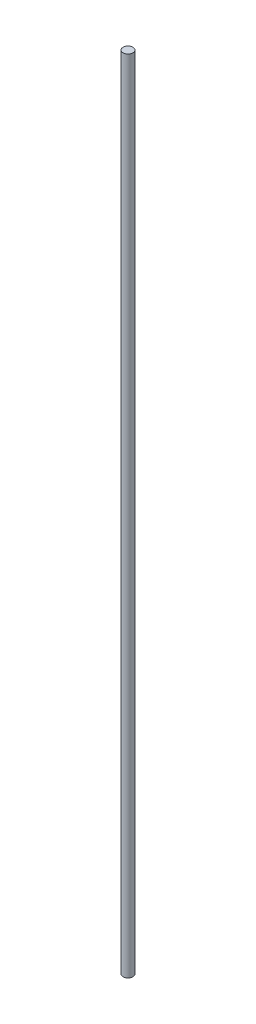
ISO-10303-21;
HEADER;
FILE_DESCRIPTION(('STEP AP214'),'2;1');
FILE_NAME('part.step','',(''),(''),'','','');
FILE_SCHEMA(('AUTOMOTIVE_DESIGN { 1 0 10303 214 1 1 1 1 }'));
ENDSEC;
DATA;
#1=APPLICATION_CONTEXT('core data for automotive mechanical design processes');
#2=APPLICATION_PROTOCOL_DEFINITION('international standard','automotive_design',2000,#1);
#3=PRODUCT_CONTEXT('',#1,'mechanical');
#4=PRODUCT('Part','Part','',(#3));
#5=PRODUCT_RELATED_PRODUCT_CATEGORY('part','',(#4));
#6=PRODUCT_DEFINITION_FORMATION('','',#4);
#7=PRODUCT_DEFINITION_CONTEXT('part definition',#1,'design');
#8=PRODUCT_DEFINITION('design','',#6,#7);
#9=PRODUCT_DEFINITION_SHAPE('','',#8);
#10=(LENGTH_UNIT() NAMED_UNIT(*) SI_UNIT(.MILLI.,.METRE.));
#11=(NAMED_UNIT(*) PLANE_ANGLE_UNIT() SI_UNIT($,.RADIAN.));
#12=(NAMED_UNIT(*) SI_UNIT($,.STERADIAN.) SOLID_ANGLE_UNIT());
#13=UNCERTAINTY_MEASURE_WITH_UNIT(LENGTH_MEASURE(1.E-05),#10,'distance_accuracy_value','');
#14=(GEOMETRIC_REPRESENTATION_CONTEXT(3) GLOBAL_UNCERTAINTY_ASSIGNED_CONTEXT((#13)) GLOBAL_UNIT_ASSIGNED_CONTEXT((#10,
#11,#12)) REPRESENTATION_CONTEXT('',''));
#15=CARTESIAN_POINT('',(0.,0.,0.));
#16=DIRECTION('',(0.,0.,1.));
#17=DIRECTION('',(1.,0.,0.));
#18=AXIS2_PLACEMENT_3D('',#15,#16,#17);
#19=CARTESIAN_POINT('',(0.,1828.8,0.));
#20=DIRECTION('',(0.,-1.,0.));
#21=DIRECTION('',(0.,0.,-1.));
#22=AXIS2_PLACEMENT_3D('',#19,#20,#21);
#23=CYLINDRICAL_SURFACE('',#22,11.25);
#24=CARTESIAN_POINT('',(0.,1828.8,0.));
#25=DIRECTION('',(0.,1.,0.));
#26=DIRECTION('',(0.,0.,1.));
#27=AXIS2_PLACEMENT_3D('',#24,#25,#26);
#28=CIRCLE('',#27,11.25);
#29=CARTESIAN_POINT('',(0.,1828.8,11.25));
#30=VERTEX_POINT('',#29);
#31=EDGE_CURVE('E10',#30,#30,#28,.T.);
#32=ORIENTED_EDGE('',*,*,#31,.F.);
#33=EDGE_LOOP('',(#32));
#34=FACE_BOUND('',#33,.T.);
#35=CARTESIAN_POINT('',(0.,0.,0.));
#36=DIRECTION('',(0.,1.,0.));
#37=DIRECTION('',(0.,0.,1.));
#38=AXIS2_PLACEMENT_3D('',#35,#36,#37);
#39=CIRCLE('',#38,11.25);
#40=CARTESIAN_POINT('',(0.,0.,11.25));
#41=VERTEX_POINT('',#40);
#42=EDGE_CURVE('E34',#41,#41,#39,.T.);
#43=ORIENTED_EDGE('',*,*,#42,.T.);
#44=EDGE_LOOP('',(#43));
#45=FACE_BOUND('',#44,.T.);
#46=ADVANCED_FACE('F31',(#34,#45),#23,.T.);
#47=CARTESIAN_POINT('',(0.,1828.8,0.));
#48=DIRECTION('',(0.,1.,0.));
#49=DIRECTION('',(0.,0.,1.));
#50=AXIS2_PLACEMENT_3D('',#47,#48,#49);
#51=PLANE('',#50);
#52=ORIENTED_EDGE('',*,*,#31,.T.);
#53=EDGE_LOOP('',(#52));
#54=FACE_BOUND('',#53,.T.);
#55=ADVANCED_FACE('F46',(#54),#51,.T.);
#56=CARTESIAN_POINT('',(0.,0.,0.));
#57=DIRECTION('',(0.,1.,0.));
#58=DIRECTION('',(0.,0.,1.));
#59=AXIS2_PLACEMENT_3D('',#56,#57,#58);
#60=PLANE('',#59);
#61=ORIENTED_EDGE('',*,*,#42,.F.);
#62=EDGE_LOOP('',(#61));
#63=FACE_BOUND('',#62,.T.);
#64=ADVANCED_FACE('F44',(#63),#60,.F.);
#65=CLOSED_SHELL('',(#46,#55,#64));
#66=MANIFOLD_SOLID_BREP('B2',#65);
#67=ADVANCED_BREP_SHAPE_REPRESENTATION('',(#18,#66),#14);
#68=SHAPE_DEFINITION_REPRESENTATION(#9,#67);
ENDSEC;
END-ISO-10303-21;
